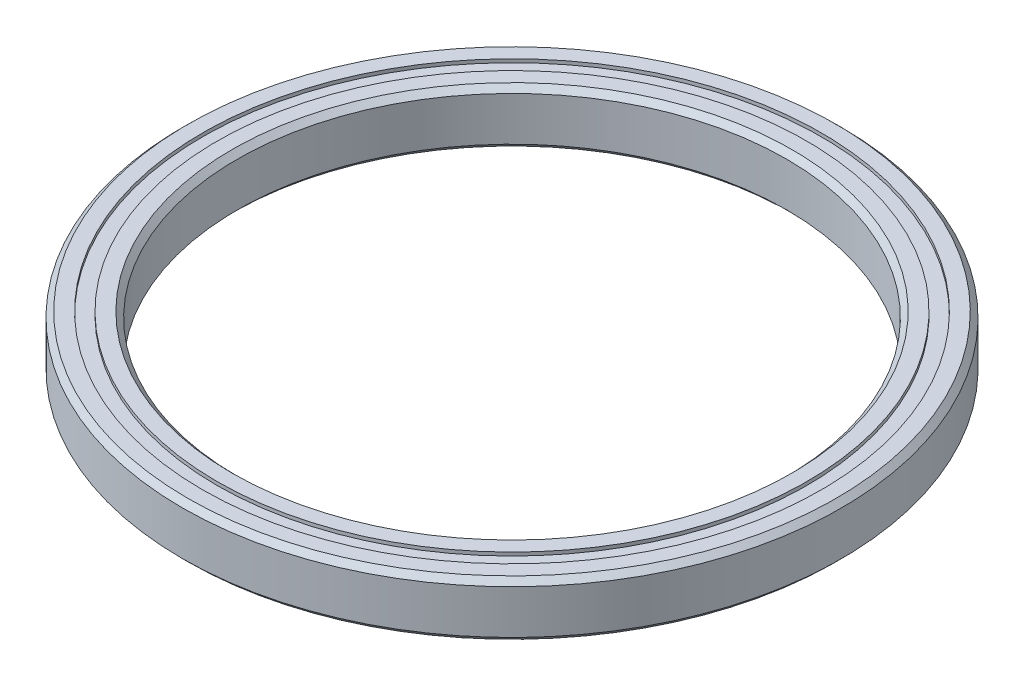
ISO-10303-21;
HEADER;
FILE_DESCRIPTION(('STEP AP214'),'2;1');
FILE_NAME('part.step','',(''),(''),'','','');
FILE_SCHEMA(('AUTOMOTIVE_DESIGN { 1 0 10303 214 1 1 1 1 }'));
ENDSEC;
DATA;
#1=APPLICATION_CONTEXT('core data for automotive mechanical design processes');
#2=APPLICATION_PROTOCOL_DEFINITION('international standard','automotive_design',2000,#1);
#3=PRODUCT_CONTEXT('',#1,'mechanical');
#4=PRODUCT('Part','Part','',(#3));
#5=PRODUCT_RELATED_PRODUCT_CATEGORY('part','',(#4));
#6=PRODUCT_DEFINITION_FORMATION('','',#4);
#7=PRODUCT_DEFINITION_CONTEXT('part definition',#1,'design');
#8=PRODUCT_DEFINITION('design','',#6,#7);
#9=PRODUCT_DEFINITION_SHAPE('','',#8);
#10=(LENGTH_UNIT() NAMED_UNIT(*) SI_UNIT(.MILLI.,.METRE.));
#11=(NAMED_UNIT(*) PLANE_ANGLE_UNIT() SI_UNIT($,.RADIAN.));
#12=(NAMED_UNIT(*) SI_UNIT($,.STERADIAN.) SOLID_ANGLE_UNIT());
#13=UNCERTAINTY_MEASURE_WITH_UNIT(LENGTH_MEASURE(1.E-05),#10,'distance_accuracy_value','');
#14=(GEOMETRIC_REPRESENTATION_CONTEXT(3) GLOBAL_UNCERTAINTY_ASSIGNED_CONTEXT((#13)) GLOBAL_UNIT_ASSIGNED_CONTEXT((#10,
#11,#12)) REPRESENTATION_CONTEXT('',''));
#15=CARTESIAN_POINT('',(0.,0.,0.));
#16=DIRECTION('',(0.,0.,1.));
#17=DIRECTION('',(1.,0.,0.));
#18=AXIS2_PLACEMENT_3D('',#15,#16,#17);
#19=CARTESIAN_POINT('',(0.,0.,0.));
#20=DIRECTION('',(0.,1.,0.));
#21=DIRECTION('',(0.,0.,1.));
#22=AXIS2_PLACEMENT_3D('',#19,#20,#21);
#23=PLANE('',#22);
#24=CARTESIAN_POINT('',(0.,0.,0.));
#25=DIRECTION('',(0.,1.,0.));
#26=DIRECTION('',(0.,0.,1.));
#27=AXIS2_PLACEMENT_3D('',#24,#25,#26);
#28=CIRCLE('',#27,40.8);
#29=CARTESIAN_POINT('',(0.,0.,40.8));
#30=VERTEX_POINT('',#29);
#31=EDGE_CURVE('E64',#30,#30,#28,.T.);
#32=ORIENTED_EDGE('',*,*,#31,.T.);
#33=EDGE_LOOP('',(#32));
#34=FACE_BOUND('',#33,.T.);
#35=CARTESIAN_POINT('',(0.,0.,0.));
#36=DIRECTION('',(0.,1.,0.));
#37=DIRECTION('',(0.,0.,1.));
#38=AXIS2_PLACEMENT_3D('',#35,#36,#37);
#39=CIRCLE('',#38,42.95);
#40=CARTESIAN_POINT('',(0.,0.,42.95));
#41=VERTEX_POINT('',#40);
#42=EDGE_CURVE('E86',#41,#41,#39,.T.);
#43=ORIENTED_EDGE('',*,*,#42,.F.);
#44=EDGE_LOOP('',(#43));
#45=FACE_BOUND('',#44,.T.);
#46=ADVANCED_FACE('F35',(#34,#45),#23,.F.);
#47=CARTESIAN_POINT('',(0.,8.,0.));
#48=DIRECTION('',(0.,1.,0.));
#49=DIRECTION('',(0.,0.,1.));
#50=AXIS2_PLACEMENT_3D('',#47,#48,#49);
#51=PLANE('',#50);
#52=CARTESIAN_POINT('',(0.,8.,0.));
#53=DIRECTION('',(0.,1.,0.));
#54=DIRECTION('',(0.,0.,1.));
#55=AXIS2_PLACEMENT_3D('',#52,#53,#54);
#56=CIRCLE('',#55,40.8);
#57=CARTESIAN_POINT('',(0.,8.,40.8));
#58=VERTEX_POINT('',#57);
#59=EDGE_CURVE('E55',#58,#58,#56,.F.);
#60=ORIENTED_EDGE('',*,*,#59,.T.);
#61=EDGE_LOOP('',(#60));
#62=FACE_BOUND('',#61,.T.);
#63=CARTESIAN_POINT('',(0.,8.,0.));
#64=DIRECTION('',(0.,1.,0.));
#65=DIRECTION('',(0.,0.,1.));
#66=AXIS2_PLACEMENT_3D('',#63,#64,#65);
#67=CIRCLE('',#66,42.95);
#68=CARTESIAN_POINT('',(0.,8.,42.95));
#69=VERTEX_POINT('',#68);
#70=EDGE_CURVE('E74',#69,#69,#67,.T.);
#71=ORIENTED_EDGE('',*,*,#70,.T.);
#72=EDGE_LOOP('',(#71));
#73=FACE_BOUND('',#72,.T.);
#74=ADVANCED_FACE('F103',(#62,#73),#51,.T.);
#75=CARTESIAN_POINT('',(0.,8.,0.));
#76=DIRECTION('',(0.,1.,0.));
#77=DIRECTION('',(0.,0.,1.));
#78=AXIS2_PLACEMENT_3D('',#75,#76,#77);
#79=CIRCLE('',#78,47.2);
#80=CARTESIAN_POINT('',(0.,8.,47.2));
#81=VERTEX_POINT('',#80);
#82=EDGE_CURVE('E10',#81,#81,#79,.T.);
#83=ORIENTED_EDGE('',*,*,#82,.T.);
#84=EDGE_LOOP('',(#83));
#85=FACE_BOUND('',#84,.T.);
#86=CARTESIAN_POINT('',(0.,8.,0.));
#87=DIRECTION('',(0.,1.,0.));
#88=DIRECTION('',(0.,0.,1.));
#89=AXIS2_PLACEMENT_3D('',#86,#87,#88);
#90=CIRCLE('',#89,45.05);
#91=CARTESIAN_POINT('',(0.,8.,45.05));
#92=VERTEX_POINT('',#91);
#93=EDGE_CURVE('E68',#92,#92,#90,.T.);
#94=ORIENTED_EDGE('',*,*,#93,.F.);
#95=EDGE_LOOP('',(#94));
#96=FACE_BOUND('',#95,.T.);
#97=ADVANCED_FACE('F110',(#85,#96),#51,.T.);
#98=CARTESIAN_POINT('',(0.,0.,0.));
#99=DIRECTION('',(0.,1.,0.));
#100=DIRECTION('',(0.,0.,1.));
#101=AXIS2_PLACEMENT_3D('',#98,#99,#100);
#102=CIRCLE('',#101,47.2);
#103=CARTESIAN_POINT('',(0.,0.,47.2));
#104=VERTEX_POINT('',#103);
#105=EDGE_CURVE('E42',#104,#104,#102,.F.);
#106=ORIENTED_EDGE('',*,*,#105,.T.);
#107=EDGE_LOOP('',(#106));
#108=FACE_BOUND('',#107,.T.);
#109=CARTESIAN_POINT('',(0.,0.,0.));
#110=DIRECTION('',(0.,1.,0.));
#111=DIRECTION('',(0.,0.,1.));
#112=AXIS2_PLACEMENT_3D('',#109,#110,#111);
#113=CIRCLE('',#112,45.05);
#114=CARTESIAN_POINT('',(0.,0.,45.05));
#115=VERTEX_POINT('',#114);
#116=EDGE_CURVE('E80',#115,#115,#113,.T.);
#117=ORIENTED_EDGE('',*,*,#116,.T.);
#118=EDGE_LOOP('',(#117));
#119=FACE_BOUND('',#118,.T.);
#120=ADVANCED_FACE('F106',(#108,#119),#23,.F.);
#121=CARTESIAN_POINT('',(0.,8.,0.));
#122=DIRECTION('',(0.,-1.,0.));
#123=DIRECTION('',(0.,0.,-1.));
#124=AXIS2_PLACEMENT_3D('',#121,#122,#123);
#125=CYLINDRICAL_SURFACE('',#124,48.);
#126=CARTESIAN_POINT('',(0.,0.800000000000002,0.));
#127=DIRECTION('',(0.,1.,0.));
#128=DIRECTION('',(0.,0.,1.));
#129=AXIS2_PLACEMENT_3D('',#126,#127,#128);
#130=CIRCLE('',#129,48.);
#131=CARTESIAN_POINT('',(0.,0.800000000000002,48.));
#132=VERTEX_POINT('',#131);
#133=EDGE_CURVE('E46',#132,#132,#130,.T.);
#134=ORIENTED_EDGE('',*,*,#133,.T.);
#135=EDGE_LOOP('',(#134));
#136=FACE_BOUND('',#135,.T.);
#137=CARTESIAN_POINT('',(0.,7.2,0.));
#138=DIRECTION('',(0.,1.,0.));
#139=DIRECTION('',(0.,0.,1.));
#140=AXIS2_PLACEMENT_3D('',#137,#138,#139);
#141=CIRCLE('',#140,48.);
#142=CARTESIAN_POINT('',(0.,7.2,48.));
#143=VERTEX_POINT('',#142);
#144=EDGE_CURVE('E50',#143,#143,#141,.F.);
#145=ORIENTED_EDGE('',*,*,#144,.T.);
#146=EDGE_LOOP('',(#145));
#147=FACE_BOUND('',#146,.T.);
#148=ADVANCED_FACE('F115',(#136,#147),#125,.T.);
#149=CARTESIAN_POINT('',(0.,8.,0.));
#150=DIRECTION('',(0.,-1.,0.));
#151=DIRECTION('',(0.,0.,-1.));
#152=AXIS2_PLACEMENT_3D('',#149,#150,#151);
#153=CYLINDRICAL_SURFACE('',#152,40.);
#154=CARTESIAN_POINT('',(0.,0.800000000000009,0.));
#155=DIRECTION('',(0.,1.,0.));
#156=DIRECTION('',(0.,0.,1.));
#157=AXIS2_PLACEMENT_3D('',#154,#155,#156);
#158=CIRCLE('',#157,40.);
#159=CARTESIAN_POINT('',(0.,0.800000000000009,40.));
#160=VERTEX_POINT('',#159);
#161=EDGE_CURVE('E58',#160,#160,#158,.F.);
#162=ORIENTED_EDGE('',*,*,#161,.T.);
#163=EDGE_LOOP('',(#162));
#164=FACE_BOUND('',#163,.T.);
#165=CARTESIAN_POINT('',(0.,7.19999999999998,0.));
#166=DIRECTION('',(0.,1.,0.));
#167=DIRECTION('',(0.,0.,1.));
#168=AXIS2_PLACEMENT_3D('',#165,#166,#167);
#169=CIRCLE('',#168,40.);
#170=CARTESIAN_POINT('',(0.,7.19999999999998,40.));
#171=VERTEX_POINT('',#170);
#172=EDGE_CURVE('E61',#171,#171,#169,.T.);
#173=ORIENTED_EDGE('',*,*,#172,.T.);
#174=EDGE_LOOP('',(#173));
#175=FACE_BOUND('',#174,.T.);
#176=ADVANCED_FACE('F120',(#164,#175),#153,.F.);
#177=CARTESIAN_POINT('',(0.,7.5,0.));
#178=DIRECTION('',(0.,1.,0.));
#179=DIRECTION('',(0.,0.,1.));
#180=AXIS2_PLACEMENT_3D('',#177,#178,#179);
#181=CYLINDRICAL_SURFACE('',#180,45.05);
#182=CARTESIAN_POINT('',(0.,7.5,0.));
#183=DIRECTION('',(0.,1.,0.));
#184=DIRECTION('',(0.,0.,1.));
#185=AXIS2_PLACEMENT_3D('',#182,#183,#184);
#186=CIRCLE('',#185,45.05);
#187=CARTESIAN_POINT('',(0.,7.5,45.05));
#188=VERTEX_POINT('',#187);
#189=EDGE_CURVE('E67',#188,#188,#186,.T.);
#190=ORIENTED_EDGE('',*,*,#189,.F.);
#191=EDGE_LOOP('',(#190));
#192=FACE_BOUND('',#191,.T.);
#193=ORIENTED_EDGE('',*,*,#93,.T.);
#194=EDGE_LOOP('',(#193));
#195=FACE_BOUND('',#194,.T.);
#196=ADVANCED_FACE('F141',(#192,#195),#181,.F.);
#197=CARTESIAN_POINT('',(0.,7.5,0.));
#198=DIRECTION('',(0.,1.,0.));
#199=DIRECTION('',(0.,0.,1.));
#200=AXIS2_PLACEMENT_3D('',#197,#198,#199);
#201=PLANE('',#200);
#202=CARTESIAN_POINT('',(0.,7.5,0.));
#203=DIRECTION('',(0.,1.,0.));
#204=DIRECTION('',(0.,0.,1.));
#205=AXIS2_PLACEMENT_3D('',#202,#203,#204);
#206=CIRCLE('',#205,42.95);
#207=CARTESIAN_POINT('',(0.,7.5,42.95));
#208=VERTEX_POINT('',#207);
#209=EDGE_CURVE('E71',#208,#208,#206,.T.);
#210=ORIENTED_EDGE('',*,*,#209,.F.);
#211=EDGE_LOOP('',(#210));
#212=FACE_BOUND('',#211,.T.);
#213=ORIENTED_EDGE('',*,*,#189,.T.);
#214=EDGE_LOOP('',(#213));
#215=FACE_BOUND('',#214,.T.);
#216=ADVANCED_FACE('F137',(#212,#215),#201,.T.);
#217=CARTESIAN_POINT('',(0.,7.5,0.));
#218=DIRECTION('',(0.,1.,0.));
#219=DIRECTION('',(0.,0.,1.));
#220=AXIS2_PLACEMENT_3D('',#217,#218,#219);
#221=CYLINDRICAL_SURFACE('',#220,42.95);
#222=ORIENTED_EDGE('',*,*,#209,.T.);
#223=EDGE_LOOP('',(#222));
#224=FACE_BOUND('',#223,.T.);
#225=ORIENTED_EDGE('',*,*,#70,.F.);
#226=EDGE_LOOP('',(#225));
#227=FACE_BOUND('',#226,.T.);
#228=ADVANCED_FACE('F131',(#224,#227),#221,.T.);
#229=CARTESIAN_POINT('',(0.,0.5,0.));
#230=DIRECTION('',(0.,1.,0.));
#231=DIRECTION('',(0.,0.,1.));
#232=AXIS2_PLACEMENT_3D('',#229,#230,#231);
#233=PLANE('',#232);
#234=CARTESIAN_POINT('',(0.,0.5,0.));
#235=DIRECTION('',(0.,1.,0.));
#236=DIRECTION('',(0.,0.,1.));
#237=AXIS2_PLACEMENT_3D('',#234,#235,#236);
#238=CIRCLE('',#237,45.05);
#239=CARTESIAN_POINT('',(0.,0.5,45.05));
#240=VERTEX_POINT('',#239);
#241=EDGE_CURVE('E77',#240,#240,#238,.T.);
#242=ORIENTED_EDGE('',*,*,#241,.F.);
#243=EDGE_LOOP('',(#242));
#244=FACE_BOUND('',#243,.T.);
#245=CARTESIAN_POINT('',(0.,0.5,0.));
#246=DIRECTION('',(0.,1.,0.));
#247=DIRECTION('',(0.,0.,1.));
#248=AXIS2_PLACEMENT_3D('',#245,#246,#247);
#249=CIRCLE('',#248,42.95);
#250=CARTESIAN_POINT('',(0.,0.5,42.95));
#251=VERTEX_POINT('',#250);
#252=EDGE_CURVE('E83',#251,#251,#249,.T.);
#253=ORIENTED_EDGE('',*,*,#252,.T.);
#254=EDGE_LOOP('',(#253));
#255=FACE_BOUND('',#254,.T.);
#256=ADVANCED_FACE('F92',(#244,#255),#233,.F.);
#257=CARTESIAN_POINT('',(0.,0.5,0.));
#258=DIRECTION('',(0.,-1.,0.));
#259=DIRECTION('',(0.,0.,-1.));
#260=AXIS2_PLACEMENT_3D('',#257,#258,#259);
#261=CYLINDRICAL_SURFACE('',#260,45.05);
#262=ORIENTED_EDGE('',*,*,#241,.T.);
#263=EDGE_LOOP('',(#262));
#264=FACE_BOUND('',#263,.T.);
#265=ORIENTED_EDGE('',*,*,#116,.F.);
#266=EDGE_LOOP('',(#265));
#267=FACE_BOUND('',#266,.T.);
#268=ADVANCED_FACE('F98',(#264,#267),#261,.F.);
#269=CARTESIAN_POINT('',(0.,0.5,0.));
#270=DIRECTION('',(0.,-1.,0.));
#271=DIRECTION('',(0.,0.,-1.));
#272=AXIS2_PLACEMENT_3D('',#269,#270,#271);
#273=CYLINDRICAL_SURFACE('',#272,42.95);
#274=ORIENTED_EDGE('',*,*,#252,.F.);
#275=EDGE_LOOP('',(#274));
#276=FACE_BOUND('',#275,.T.);
#277=ORIENTED_EDGE('',*,*,#42,.T.);
#278=EDGE_LOOP('',(#277));
#279=FACE_BOUND('',#278,.T.);
#280=ADVANCED_FACE('F94',(#276,#279),#273,.T.);
#281=CARTESIAN_POINT('',(0.,0.,0.));
#282=DIRECTION('',(0.,-1.,0.));
#283=DIRECTION('',(0.,0.,-1.));
#284=AXIS2_PLACEMENT_3D('',#281,#282,#283);
#285=CONICAL_SURFACE('',#284,40.8,0.785398163397448);
#286=ORIENTED_EDGE('',*,*,#161,.F.);
#287=EDGE_LOOP('',(#286));
#288=FACE_BOUND('',#287,.T.);
#289=ORIENTED_EDGE('',*,*,#31,.F.);
#290=EDGE_LOOP('',(#289));
#291=FACE_BOUND('',#290,.T.);
#292=ADVANCED_FACE('F97',(#288,#291),#285,.F.);
#293=CARTESIAN_POINT('',(0.,7.19999999999998,0.));
#294=DIRECTION('',(0.,1.,0.));
#295=DIRECTION('',(0.,0.,1.));
#296=AXIS2_PLACEMENT_3D('',#293,#294,#295);
#297=CONICAL_SURFACE('',#296,40.,0.785398163397444);
#298=ORIENTED_EDGE('',*,*,#59,.F.);
#299=EDGE_LOOP('',(#298));
#300=FACE_BOUND('',#299,.T.);
#301=ORIENTED_EDGE('',*,*,#172,.F.);
#302=EDGE_LOOP('',(#301));
#303=FACE_BOUND('',#302,.T.);
#304=ADVANCED_FACE('F154',(#300,#303),#297,.F.);
#305=CARTESIAN_POINT('',(0.,0.800000000000002,0.));
#306=DIRECTION('',(0.,1.,0.));
#307=DIRECTION('',(0.,0.,1.));
#308=AXIS2_PLACEMENT_3D('',#305,#306,#307);
#309=CONICAL_SURFACE('',#308,48.,0.785398163397444);
#310=ORIENTED_EDGE('',*,*,#105,.F.);
#311=EDGE_LOOP('',(#310));
#312=FACE_BOUND('',#311,.T.);
#313=ORIENTED_EDGE('',*,*,#133,.F.);
#314=EDGE_LOOP('',(#313));
#315=FACE_BOUND('',#314,.T.);
#316=ADVANCED_FACE('F156',(#312,#315),#309,.T.);
#317=CARTESIAN_POINT('',(0.,8.,0.));
#318=DIRECTION('',(0.,-1.,0.));
#319=DIRECTION('',(0.,0.,-1.));
#320=AXIS2_PLACEMENT_3D('',#317,#318,#319);
#321=CONICAL_SURFACE('',#320,47.2,0.785398163397453);
#322=ORIENTED_EDGE('',*,*,#144,.F.);
#323=EDGE_LOOP('',(#322));
#324=FACE_BOUND('',#323,.T.);
#325=ORIENTED_EDGE('',*,*,#82,.F.);
#326=EDGE_LOOP('',(#325));
#327=FACE_BOUND('',#326,.T.);
#328=ADVANCED_FACE('F37',(#324,#327),#321,.T.);
#329=CLOSED_SHELL('',(#46,#74,#97,#120,#148,#176,#196,#216,#228,#256,#268,#280,#292,#304,#316,#328));
#330=MANIFOLD_SOLID_BREP('B2',#329);
#331=ADVANCED_BREP_SHAPE_REPRESENTATION('',(#18,#330),#14);
#332=SHAPE_DEFINITION_REPRESENTATION(#9,#331);
ENDSEC;
END-ISO-10303-21;
